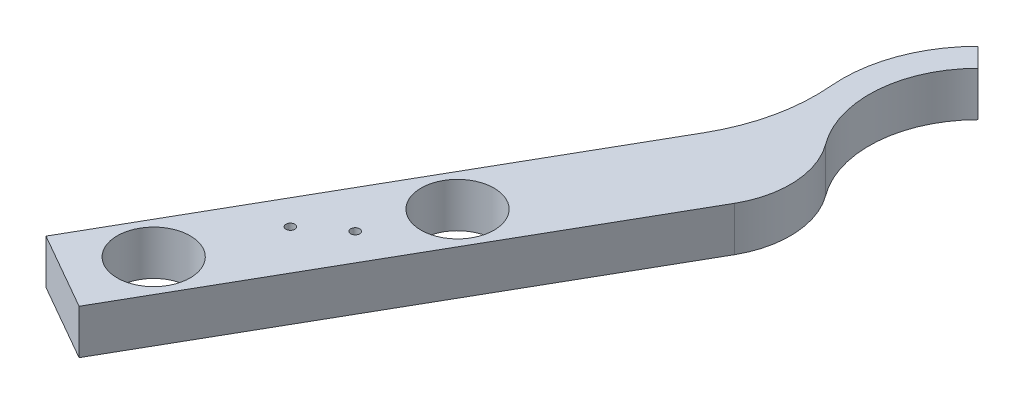
ISO-10303-21;
HEADER;
FILE_DESCRIPTION(('STEP AP214'),'2;1');
FILE_NAME('part.step','',(''),(''),'','','');
FILE_SCHEMA(('AUTOMOTIVE_DESIGN { 1 0 10303 214 1 1 1 1 }'));
ENDSEC;
DATA;
#1=APPLICATION_CONTEXT('core data for automotive mechanical design processes');
#2=APPLICATION_PROTOCOL_DEFINITION('international standard','automotive_design',2000,#1);
#3=PRODUCT_CONTEXT('',#1,'mechanical');
#4=PRODUCT('Part','Part','',(#3));
#5=PRODUCT_RELATED_PRODUCT_CATEGORY('part','',(#4));
#6=PRODUCT_DEFINITION_FORMATION('','',#4);
#7=PRODUCT_DEFINITION_CONTEXT('part definition',#1,'design');
#8=PRODUCT_DEFINITION('design','',#6,#7);
#9=PRODUCT_DEFINITION_SHAPE('','',#8);
#10=(LENGTH_UNIT() NAMED_UNIT(*) SI_UNIT(.MILLI.,.METRE.));
#11=(NAMED_UNIT(*) PLANE_ANGLE_UNIT() SI_UNIT($,.RADIAN.));
#12=(NAMED_UNIT(*) SI_UNIT($,.STERADIAN.) SOLID_ANGLE_UNIT());
#13=UNCERTAINTY_MEASURE_WITH_UNIT(LENGTH_MEASURE(1.E-05),#10,'distance_accuracy_value','');
#14=(GEOMETRIC_REPRESENTATION_CONTEXT(3) GLOBAL_UNCERTAINTY_ASSIGNED_CONTEXT((#13)) GLOBAL_UNIT_ASSIGNED_CONTEXT((#10,
#11,#12)) REPRESENTATION_CONTEXT('',''));
#15=CARTESIAN_POINT('',(0.,0.,0.));
#16=DIRECTION('',(0.,0.,1.));
#17=DIRECTION('',(1.,0.,0.));
#18=AXIS2_PLACEMENT_3D('',#15,#16,#17);
#19=CARTESIAN_POINT('',(29.577615884705,5.,-29.5776158847047));
#20=DIRECTION('',(0.707106781186551,0.,-0.707106781186544));
#21=DIRECTION('',(-0.707106781186544,0.,-0.707106781186551));
#22=AXIS2_PLACEMENT_3D('',#19,#20,#21);
#23=PLANE('',#22);
#24=DIRECTION('',(0.707106781186544,0.,0.707106781186551));
#25=VECTOR('',#24,1.);
#26=CARTESIAN_POINT('',(29.577615884705,0.,-29.5776158847047));
#27=LINE('',#26,#25);
#28=CARTESIAN_POINT('',(13.6481235775326,0.,-45.5071081918772));
#29=VERTEX_POINT('',#28);
#30=CARTESIAN_POINT('',(15.7871215906219,0.,-43.3681101787879));
#31=VERTEX_POINT('',#30);
#32=EDGE_CURVE('E113',#29,#31,#27,.T.);
#33=ORIENTED_EDGE('',*,*,#32,.F.);
#34=DIRECTION('',(0.,-1.,0.));
#35=VECTOR('',#34,1.);
#36=CARTESIAN_POINT('',(13.6481235775326,5.,-45.5071081918772));
#37=LINE('',#36,#35);
#38=CARTESIAN_POINT('',(13.6481235775326,5.,-45.5071081918772));
#39=VERTEX_POINT('',#38);
#40=EDGE_CURVE('E107',#39,#29,#37,.T.);
#41=ORIENTED_EDGE('',*,*,#40,.F.);
#42=DIRECTION('',(0.707106781186544,0.,0.707106781186551));
#43=VECTOR('',#42,1.);
#44=CARTESIAN_POINT('',(29.577615884705,5.,-29.5776158847047));
#45=LINE('',#44,#43);
#46=CARTESIAN_POINT('',(15.7871215906219,5.,-43.3681101787879));
#47=VERTEX_POINT('',#46);
#48=EDGE_CURVE('E110',#39,#47,#45,.T.);
#49=ORIENTED_EDGE('',*,*,#48,.T.);
#50=DIRECTION('',(0.,-1.,0.));
#51=VECTOR('',#50,1.);
#52=CARTESIAN_POINT('',(15.7871215906219,5.,-43.3681101787879));
#53=LINE('',#52,#51);
#54=EDGE_CURVE('E165',#47,#31,#53,.T.);
#55=ORIENTED_EDGE('',*,*,#54,.T.);
#56=EDGE_LOOP('',(#33,#41,#49,#55));
#57=FACE_BOUND('',#56,.T.);
#58=ADVANCED_FACE('F41',(#57),#23,.T.);
#59=CARTESIAN_POINT('',(24.4315019906274,5.,-34.7237297787823));
#60=DIRECTION('',(0.,-1.,0.));
#61=DIRECTION('',(0.,0.,-1.));
#62=AXIS2_PLACEMENT_3D('',#59,#60,#61);
#63=CYLINDRICAL_SURFACE('',#62,15.25);
#64=CARTESIAN_POINT('',(24.4315019906274,0.,-34.7237297787823));
#65=DIRECTION('',(0.,1.,0.));
#66=DIRECTION('',(0.,0.,1.));
#67=AXIS2_PLACEMENT_3D('',#64,#65,#66);
#68=CIRCLE('',#67,15.25);
#69=CARTESIAN_POINT('',(9.23903266316209,0.,-33.4003342468167));
#70=VERTEX_POINT('',#69);
#71=EDGE_CURVE('E168',#29,#70,#68,.T.);
#72=ORIENTED_EDGE('',*,*,#71,.T.);
#73=DIRECTION('',(0.,-1.,0.));
#74=VECTOR('',#73,1.);
#75=CARTESIAN_POINT('',(9.23903266316209,5.,-33.4003342468167));
#76=LINE('',#75,#74);
#77=CARTESIAN_POINT('',(9.23903266316209,5.,-33.4003342468167));
#78=VERTEX_POINT('',#77);
#79=EDGE_CURVE('E125',#70,#78,#76,.F.);
#80=ORIENTED_EDGE('',*,*,#79,.T.);
#81=CARTESIAN_POINT('',(24.4315019906274,5.,-34.7237297787823));
#82=DIRECTION('',(0.,1.,0.));
#83=DIRECTION('',(0.,0.,1.));
#84=AXIS2_PLACEMENT_3D('',#81,#82,#83);
#85=CIRCLE('',#84,15.25);
#86=EDGE_CURVE('E122',#39,#78,#85,.T.);
#87=ORIENTED_EDGE('',*,*,#86,.F.);
#88=ORIENTED_EDGE('',*,*,#40,.T.);
#89=EDGE_LOOP('',(#72,#80,#87,#88));
#90=FACE_BOUND('',#89,.T.);
#91=ADVANCED_FACE('F123',(#90),#63,.T.);
#92=CARTESIAN_POINT('',(-4.33984347856211,5.,-2.48309455751929));
#93=DIRECTION('',(-0.867968695712422,0.,-0.496618911503858));
#94=DIRECTION('',(-0.496618911503858,0.,0.867968695712422));
#95=AXIS2_PLACEMENT_3D('',#92,#93,#94);
#96=PLANE('',#95);
#97=DIRECTION('',(0.496618911503858,0.,-0.867968695712422));
#98=VECTOR('',#97,1.);
#99=CARTESIAN_POINT('',(-4.33984347856211,5.,-2.48309455751929));
#100=LINE('',#99,#98);
#101=CARTESIAN_POINT('',(-20.2196240700926,5.,25.2708876790655));
#102=VERTEX_POINT('',#101);
#103=CARTESIAN_POINT('',(6.67385663975114,5.,-21.7323553190798));
#104=VERTEX_POINT('',#103);
#105=EDGE_CURVE('E129',#102,#104,#100,.T.);
#106=ORIENTED_EDGE('',*,*,#105,.T.);
#107=DIRECTION('',(0.,-1.,0.));
#108=VECTOR('',#107,1.);
#109=CARTESIAN_POINT('',(6.67385663975114,5.,-21.7323553190798));
#110=LINE('',#109,#108);
#111=CARTESIAN_POINT('',(6.67385663975114,0.,-21.7323553190798));
#112=VERTEX_POINT('',#111);
#113=EDGE_CURVE('E118',#104,#112,#110,.T.);
#114=ORIENTED_EDGE('',*,*,#113,.T.);
#115=DIRECTION('',(0.496618911503858,0.,-0.867968695712422));
#116=VECTOR('',#115,1.);
#117=CARTESIAN_POINT('',(-4.33984347856211,0.,-2.48309455751929));
#118=LINE('',#117,#116);
#119=CARTESIAN_POINT('',(-20.2196240700926,0.,25.2708876790655));
#120=VERTEX_POINT('',#119);
#121=EDGE_CURVE('E172',#120,#112,#118,.T.);
#122=ORIENTED_EDGE('',*,*,#121,.F.);
#123=DIRECTION('',(0.,-1.,0.));
#124=VECTOR('',#123,1.);
#125=CARTESIAN_POINT('',(-20.2196240700926,5.,25.2708876790655));
#126=LINE('',#125,#124);
#127=EDGE_CURVE('E119',#102,#120,#126,.T.);
#128=ORIENTED_EDGE('',*,*,#127,.F.);
#129=EDGE_LOOP('',(#106,#114,#122,#128));
#130=FACE_BOUND('',#129,.T.);
#131=ADVANCED_FACE('F226',(#130),#96,.T.);
#132=CARTESIAN_POINT('',(-15.8797805915305,5.,27.7539822365848));
#133=DIRECTION('',(0.496618911503858,0.,-0.867968695712422));
#134=DIRECTION('',(-0.867968695712422,0.,-0.496618911503858));
#135=AXIS2_PLACEMENT_3D('',#132,#133,#134);
#136=PLANE('',#135);
#137=DIRECTION('',(0.867968695712422,0.,0.496618911503858));
#138=VECTOR('',#137,1.);
#139=CARTESIAN_POINT('',(-15.8797805915305,0.,27.7539822365848));
#140=LINE('',#139,#138);
#141=CARTESIAN_POINT('',(-11.5399371129684,0.,30.2370767941041));
#142=VERTEX_POINT('',#141);
#143=EDGE_CURVE('E176',#120,#142,#140,.T.);
#144=ORIENTED_EDGE('',*,*,#143,.T.);
#145=DIRECTION('',(0.,-1.,0.));
#146=VECTOR('',#145,1.);
#147=CARTESIAN_POINT('',(-11.5399371129684,5.,30.2370767941041));
#148=LINE('',#147,#146);
#149=CARTESIAN_POINT('',(-11.5399371129684,5.,30.2370767941041));
#150=VERTEX_POINT('',#149);
#151=EDGE_CURVE('E190',#150,#142,#148,.T.);
#152=ORIENTED_EDGE('',*,*,#151,.F.);
#153=DIRECTION('',(0.867968695712422,0.,0.496618911503858));
#154=VECTOR('',#153,1.);
#155=CARTESIAN_POINT('',(-15.8797805915305,5.,27.7539822365848));
#156=LINE('',#155,#154);
#157=EDGE_CURVE('E149',#102,#150,#156,.T.);
#158=ORIENTED_EDGE('',*,*,#157,.F.);
#159=ORIENTED_EDGE('',*,*,#127,.T.);
#160=EDGE_LOOP('',(#144,#152,#158,#159));
#161=FACE_BOUND('',#160,.T.);
#162=ADVANCED_FACE('F232',(#161),#136,.F.);
#163=CARTESIAN_POINT('',(4.33984347856211,5.,2.48309455751929));
#164=DIRECTION('',(-0.867968695712422,0.,-0.496618911503858));
#165=DIRECTION('',(-0.496618911503858,0.,0.867968695712422));
#166=AXIS2_PLACEMENT_3D('',#163,#164,#165);
#167=PLANE('',#166);
#168=DIRECTION('',(0.496618911503858,0.,-0.867968695712422));
#169=VECTOR('',#168,1.);
#170=CARTESIAN_POINT('',(4.33984347856211,0.,2.48309455751929));
#171=LINE('',#170,#169);
#172=CARTESIAN_POINT('',(15.2326737474871,0.,-16.554915196288));
#173=VERTEX_POINT('',#172);
#174=EDGE_CURVE('E179',#142,#173,#171,.T.);
#175=ORIENTED_EDGE('',*,*,#174,.T.);
#176=DIRECTION('',(0.,1.,0.));
#177=VECTOR('',#176,1.);
#178=CARTESIAN_POINT('',(15.2326737474871,5.,-16.554915196288));
#179=LINE('',#178,#177);
#180=CARTESIAN_POINT('',(15.2326737474871,5.,-16.554915196288));
#181=VERTEX_POINT('',#180);
#182=EDGE_CURVE('E50',#173,#181,#179,.T.);
#183=ORIENTED_EDGE('',*,*,#182,.T.);
#184=DIRECTION('',(0.496618911503858,0.,-0.867968695712422));
#185=VECTOR('',#184,1.);
#186=CARTESIAN_POINT('',(4.33984347856211,5.,2.48309455751929));
#187=LINE('',#186,#185);
#188=EDGE_CURVE('E152',#150,#181,#187,.T.);
#189=ORIENTED_EDGE('',*,*,#188,.F.);
#190=ORIENTED_EDGE('',*,*,#151,.T.);
#191=EDGE_LOOP('',(#175,#183,#189,#190));
#192=FACE_BOUND('',#191,.T.);
#193=ADVANCED_FACE('F272',(#192),#167,.F.);
#194=CARTESIAN_POINT('',(0.260334032344891,5.,-0.455000374068905));
#195=DIRECTION('',(0.,-1.,0.));
#196=DIRECTION('',(0.,0.,-1.));
#197=AXIS2_PLACEMENT_3D('',#194,#195,#196);
#198=CYLINDRICAL_SURFACE('',#197,4.1);
#199=CARTESIAN_POINT('',(0.260334032344891,5.,-0.455000374068905));
#200=DIRECTION('',(0.,1.,0.));
#201=DIRECTION('',(0.,0.,1.));
#202=AXIS2_PLACEMENT_3D('',#199,#200,#201);
#203=CIRCLE('',#202,4.1);
#204=CARTESIAN_POINT('',(0.260334032344891,5.,3.64499962593109));
#205=VERTEX_POINT('',#204);
#206=EDGE_CURVE('E157',#205,#205,#203,.T.);
#207=ORIENTED_EDGE('',*,*,#206,.T.);
#208=EDGE_LOOP('',(#207));
#209=FACE_BOUND('',#208,.T.);
#210=CARTESIAN_POINT('',(0.260334032344891,0.,-0.455000374068905));
#211=DIRECTION('',(0.,1.,0.));
#212=DIRECTION('',(0.,0.,1.));
#213=AXIS2_PLACEMENT_3D('',#210,#211,#212);
#214=CIRCLE('',#213,4.1);
#215=CARTESIAN_POINT('',(0.260334032344891,0.,3.64499962593109));
#216=VERTEX_POINT('',#215);
#217=EDGE_CURVE('E140',#216,#216,#214,.T.);
#218=ORIENTED_EDGE('',*,*,#217,.F.);
#219=EDGE_LOOP('',(#218));
#220=FACE_BOUND('',#219,.T.);
#221=ADVANCED_FACE('F269',(#209,#220),#198,.F.);
#222=CARTESIAN_POINT('',(24.4315019906274,5.,-34.7237297787823));
#223=DIRECTION('',(0.,-1.,0.));
#224=DIRECTION('',(0.,0.,-1.));
#225=AXIS2_PLACEMENT_3D('',#222,#223,#224);
#226=CYLINDRICAL_SURFACE('',#225,12.225);
#227=CARTESIAN_POINT('',(24.4315019906274,5.,-34.7237297787823));
#228=DIRECTION('',(0.,1.,0.));
#229=DIRECTION('',(0.,0.,1.));
#230=AXIS2_PLACEMENT_3D('',#227,#228,#229);
#231=CIRCLE('',#230,12.225);
#232=CARTESIAN_POINT('',(14.5973130896945,5.,-27.4615432168185));
#233=VERTEX_POINT('',#232);
#234=EDGE_CURVE('E134',#47,#233,#231,.T.);
#235=ORIENTED_EDGE('',*,*,#234,.T.);
#236=DIRECTION('',(0.,-1.,0.));
#237=VECTOR('',#236,1.);
#238=CARTESIAN_POINT('',(14.5973130896945,5.,-27.4615432168185));
#239=LINE('',#238,#237);
#240=CARTESIAN_POINT('',(14.5973130896945,0.,-27.4615432168185));
#241=VERTEX_POINT('',#240);
#242=EDGE_CURVE('E207',#233,#241,#239,.T.);
#243=ORIENTED_EDGE('',*,*,#242,.T.);
#244=CARTESIAN_POINT('',(24.4315019906274,0.,-34.7237297787823));
#245=DIRECTION('',(0.,1.,0.));
#246=DIRECTION('',(0.,0.,1.));
#247=AXIS2_PLACEMENT_3D('',#244,#245,#246);
#248=CIRCLE('',#247,12.225);
#249=EDGE_CURVE('E182',#31,#241,#248,.T.);
#250=ORIENTED_EDGE('',*,*,#249,.F.);
#251=ORIENTED_EDGE('',*,*,#54,.F.);
#252=EDGE_LOOP('',(#235,#243,#250,#251));
#253=FACE_BOUND('',#252,.T.);
#254=ADVANCED_FACE('F216',(#253),#226,.F.);
#255=CARTESIAN_POINT('',(-12.1551387552516,5.,21.2442170187416));
#256=DIRECTION('',(0.,-1.,0.));
#257=DIRECTION('',(0.,0.,-1.));
#258=AXIS2_PLACEMENT_3D('',#255,#256,#257);
#259=CYLINDRICAL_SURFACE('',#258,4.1);
#260=CARTESIAN_POINT('',(-12.1551387552516,5.,21.2442170187416));
#261=DIRECTION('',(0.,1.,0.));
#262=DIRECTION('',(0.,0.,1.));
#263=AXIS2_PLACEMENT_3D('',#260,#261,#262);
#264=CIRCLE('',#263,4.1);
#265=CARTESIAN_POINT('',(-12.1551387552516,5.,25.3442170187416));
#266=VERTEX_POINT('',#265);
#267=EDGE_CURVE('E161',#266,#266,#264,.T.);
#268=ORIENTED_EDGE('',*,*,#267,.T.);
#269=EDGE_LOOP('',(#268));
#270=FACE_BOUND('',#269,.T.);
#271=CARTESIAN_POINT('',(-12.1551387552516,0.,21.2442170187416));
#272=DIRECTION('',(0.,1.,0.));
#273=DIRECTION('',(0.,0.,1.));
#274=AXIS2_PLACEMENT_3D('',#271,#272,#273);
#275=CIRCLE('',#274,4.1);
#276=CARTESIAN_POINT('',(-12.1551387552516,0.,25.3442170187416));
#277=VERTEX_POINT('',#276);
#278=EDGE_CURVE('E136',#277,#277,#275,.T.);
#279=ORIENTED_EDGE('',*,*,#278,.F.);
#280=EDGE_LOOP('',(#279));
#281=FACE_BOUND('',#280,.T.);
#282=ADVANCED_FACE('F260',(#270,#281),#259,.F.);
#283=CARTESIAN_POINT('',(0.,5.,0.));
#284=DIRECTION('',(0.,1.,0.));
#285=DIRECTION('',(0.,0.,1.));
#286=AXIS2_PLACEMENT_3D('',#283,#284,#285);
#287=PLANE('',#286);
#288=CARTESIAN_POINT('',(-7.40873850945122,5.,10.6393076647307));
#289=DIRECTION('',(0.,1.,0.));
#290=DIRECTION('',(0.,0.,1.));
#291=AXIS2_PLACEMENT_3D('',#288,#289,#290);
#292=CIRCLE('',#291,0.500000000000001);
#293=CARTESIAN_POINT('',(-7.40873850945122,5.,11.1393076647307));
#294=VERTEX_POINT('',#293);
#295=EDGE_CURVE('E423',#294,#294,#292,.T.);
#296=ORIENTED_EDGE('',*,*,#295,.F.);
#297=EDGE_LOOP('',(#296));
#298=FACE_BOUND('',#297,.T.);
#299=CARTESIAN_POINT('',(-3.32949959349636,5.,7.44442417302462));
#300=DIRECTION('',(0.,1.,0.));
#301=DIRECTION('',(0.,0.,1.));
#302=AXIS2_PLACEMENT_3D('',#299,#300,#301);
#303=CIRCLE('',#302,0.5);
#304=CARTESIAN_POINT('',(-3.32949959349636,5.,7.94442417302462));
#305=VERTEX_POINT('',#304);
#306=EDGE_CURVE('E143',#305,#305,#303,.T.);
#307=ORIENTED_EDGE('',*,*,#306,.F.);
#308=EDGE_LOOP('',(#307));
#309=FACE_BOUND('',#308,.T.);
#310=ORIENTED_EDGE('',*,*,#188,.T.);
#311=CARTESIAN_POINT('',(6.55298679036287,5.,-21.5211043113266));
#312=DIRECTION('',(0.,1.,0.));
#313=DIRECTION('',(0.,0.,1.));
#314=AXIS2_PLACEMENT_3D('',#311,#312,#313);
#315=CIRCLE('',#314,10.);
#316=EDGE_CURVE('E11',#181,#233,#315,.T.);
#317=ORIENTED_EDGE('',*,*,#316,.T.);
#318=ORIENTED_EDGE('',*,*,#234,.F.);
#319=ORIENTED_EDGE('',*,*,#48,.F.);
#320=ORIENTED_EDGE('',*,*,#86,.T.);
#321=CARTESIAN_POINT('',(-10.6855172744973,5.,-31.6647335491569));
#322=DIRECTION('',(0.,1.,0.));
#323=DIRECTION('',(0.,0.,1.));
#324=AXIS2_PLACEMENT_3D('',#321,#322,#323);
#325=CIRCLE('',#324,20.);
#326=EDGE_CURVE('E204',#78,#104,#325,.F.);
#327=ORIENTED_EDGE('',*,*,#326,.T.);
#328=ORIENTED_EDGE('',*,*,#105,.F.);
#329=ORIENTED_EDGE('',*,*,#157,.T.);
#330=EDGE_LOOP('',(#310,#317,#318,#319,#320,#327,#328,#329));
#331=FACE_BOUND('',#330,.T.);
#332=ORIENTED_EDGE('',*,*,#206,.F.);
#333=EDGE_LOOP('',(#332));
#334=FACE_BOUND('',#333,.T.);
#335=ORIENTED_EDGE('',*,*,#267,.F.);
#336=EDGE_LOOP('',(#335));
#337=FACE_BOUND('',#336,.T.);
#338=ADVANCED_FACE('F131',(#298,#309,#331,#334,#337),#287,.T.);
#339=CARTESIAN_POINT('',(0.,0.,0.));
#340=DIRECTION('',(0.,1.,0.));
#341=DIRECTION('',(0.,0.,1.));
#342=AXIS2_PLACEMENT_3D('',#339,#340,#341);
#343=PLANE('',#342);
#344=CARTESIAN_POINT('',(-7.40873850945122,0.,10.6393076647307));
#345=DIRECTION('',(0.,1.,0.));
#346=DIRECTION('',(0.,0.,1.));
#347=AXIS2_PLACEMENT_3D('',#344,#345,#346);
#348=CIRCLE('',#347,0.500000000000001);
#349=CARTESIAN_POINT('',(-7.40873850945122,0.,11.1393076647307));
#350=VERTEX_POINT('',#349);
#351=EDGE_CURVE('E169',#350,#350,#348,.T.);
#352=ORIENTED_EDGE('',*,*,#351,.T.);
#353=EDGE_LOOP('',(#352));
#354=FACE_BOUND('',#353,.T.);
#355=CARTESIAN_POINT('',(-3.32949959349636,0.,7.44442417302462));
#356=DIRECTION('',(0.,1.,0.));
#357=DIRECTION('',(0.,0.,1.));
#358=AXIS2_PLACEMENT_3D('',#355,#356,#357);
#359=CIRCLE('',#358,0.5);
#360=CARTESIAN_POINT('',(-3.32949959349636,0.,7.94442417302462));
#361=VERTEX_POINT('',#360);
#362=EDGE_CURVE('E421',#361,#361,#359,.T.);
#363=ORIENTED_EDGE('',*,*,#362,.T.);
#364=EDGE_LOOP('',(#363));
#365=FACE_BOUND('',#364,.T.);
#366=ORIENTED_EDGE('',*,*,#249,.T.);
#367=CARTESIAN_POINT('',(6.55298679036287,0.,-21.5211043113266));
#368=DIRECTION('',(0.,1.,0.));
#369=DIRECTION('',(0.,0.,1.));
#370=AXIS2_PLACEMENT_3D('',#367,#368,#369);
#371=CIRCLE('',#370,10.);
#372=EDGE_CURVE('E64',#241,#173,#371,.F.);
#373=ORIENTED_EDGE('',*,*,#372,.T.);
#374=ORIENTED_EDGE('',*,*,#174,.F.);
#375=ORIENTED_EDGE('',*,*,#143,.F.);
#376=ORIENTED_EDGE('',*,*,#121,.T.);
#377=CARTESIAN_POINT('',(-10.6855172744973,0.,-31.6647335491569));
#378=DIRECTION('',(0.,1.,0.));
#379=DIRECTION('',(0.,0.,1.));
#380=AXIS2_PLACEMENT_3D('',#377,#378,#379);
#381=CIRCLE('',#380,20.);
#382=EDGE_CURVE('E201',#112,#70,#381,.T.);
#383=ORIENTED_EDGE('',*,*,#382,.T.);
#384=ORIENTED_EDGE('',*,*,#71,.F.);
#385=ORIENTED_EDGE('',*,*,#32,.T.);
#386=EDGE_LOOP('',(#366,#373,#374,#375,#376,#383,#384,#385));
#387=FACE_BOUND('',#386,.T.);
#388=ORIENTED_EDGE('',*,*,#217,.T.);
#389=EDGE_LOOP('',(#388));
#390=FACE_BOUND('',#389,.T.);
#391=ORIENTED_EDGE('',*,*,#278,.T.);
#392=EDGE_LOOP('',(#391));
#393=FACE_BOUND('',#392,.T.);
#394=ADVANCED_FACE('F219',(#354,#365,#387,#390,#393),#343,.F.);
#395=CARTESIAN_POINT('',(-10.6855172744973,5.,-31.6647335491569));
#396=DIRECTION('',(0.,-1.,0.));
#397=DIRECTION('',(0.,0.,-1.));
#398=AXIS2_PLACEMENT_3D('',#395,#396,#397);
#399=CYLINDRICAL_SURFACE('',#398,20.);
#400=ORIENTED_EDGE('',*,*,#326,.F.);
#401=ORIENTED_EDGE('',*,*,#79,.F.);
#402=ORIENTED_EDGE('',*,*,#382,.F.);
#403=ORIENTED_EDGE('',*,*,#113,.F.);
#404=EDGE_LOOP('',(#400,#401,#402,#403));
#405=FACE_BOUND('',#404,.T.);
#406=ADVANCED_FACE('F222',(#405),#399,.F.);
#407=CARTESIAN_POINT('',(-3.32949959349636,0.,7.44442417302462));
#408=DIRECTION('',(0.,1.,0.));
#409=DIRECTION('',(0.,0.,1.));
#410=AXIS2_PLACEMENT_3D('',#407,#408,#409);
#411=CYLINDRICAL_SURFACE('',#410,0.5);
#412=ORIENTED_EDGE('',*,*,#362,.F.);
#413=EDGE_LOOP('',(#412));
#414=FACE_BOUND('',#413,.T.);
#415=ORIENTED_EDGE('',*,*,#306,.T.);
#416=EDGE_LOOP('',(#415));
#417=FACE_BOUND('',#416,.T.);
#418=ADVANCED_FACE('F238',(#414,#417),#411,.F.);
#419=CARTESIAN_POINT('',(-7.40873850945122,0.,10.6393076647307));
#420=DIRECTION('',(0.,1.,0.));
#421=DIRECTION('',(0.,0.,1.));
#422=AXIS2_PLACEMENT_3D('',#419,#420,#421);
#423=CYLINDRICAL_SURFACE('',#422,0.500000000000001);
#424=ORIENTED_EDGE('',*,*,#351,.F.);
#425=EDGE_LOOP('',(#424));
#426=FACE_BOUND('',#425,.T.);
#427=ORIENTED_EDGE('',*,*,#295,.T.);
#428=EDGE_LOOP('',(#427));
#429=FACE_BOUND('',#428,.T.);
#430=ADVANCED_FACE('F234',(#426,#429),#423,.F.);
#431=CARTESIAN_POINT('',(6.55298679036287,5.,-21.5211043113266));
#432=DIRECTION('',(0.,-1.,0.));
#433=DIRECTION('',(0.,0.,-1.));
#434=AXIS2_PLACEMENT_3D('',#431,#432,#433);
#435=CYLINDRICAL_SURFACE('',#434,10.);
#436=ORIENTED_EDGE('',*,*,#316,.F.);
#437=ORIENTED_EDGE('',*,*,#182,.F.);
#438=ORIENTED_EDGE('',*,*,#372,.F.);
#439=ORIENTED_EDGE('',*,*,#242,.F.);
#440=EDGE_LOOP('',(#436,#437,#438,#439));
#441=FACE_BOUND('',#440,.T.);
#442=ADVANCED_FACE('F43',(#441),#435,.T.);
#443=CLOSED_SHELL('',(#58,#91,#131,#162,#193,#221,#254,#282,#338,#394,#406,#418,#430,#442));
#444=MANIFOLD_SOLID_BREP('B2',#443);
#445=ADVANCED_BREP_SHAPE_REPRESENTATION('',(#18,#444),#14);
#446=SHAPE_DEFINITION_REPRESENTATION(#9,#445);
ENDSEC;
END-ISO-10303-21;
